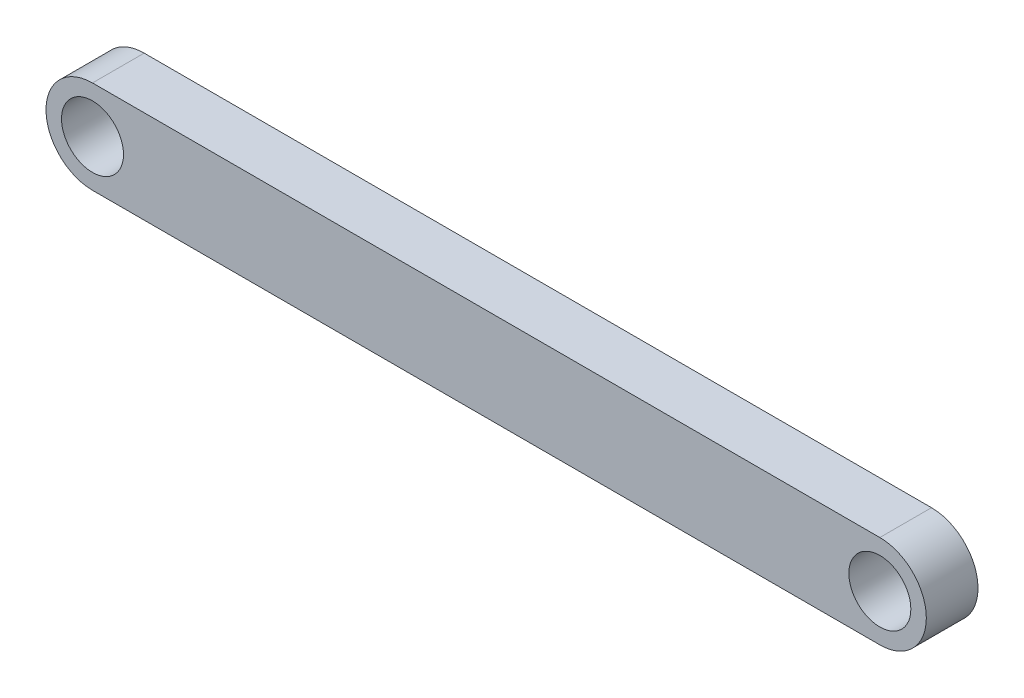
ISO-10303-21;
HEADER;
FILE_DESCRIPTION(('STEP AP214'),'2;1');
FILE_NAME('part.step','',(''),(''),'','','');
FILE_SCHEMA(('AUTOMOTIVE_DESIGN { 1 0 10303 214 1 1 1 1 }'));
ENDSEC;
DATA;
#1=APPLICATION_CONTEXT('core data for automotive mechanical design processes');
#2=APPLICATION_PROTOCOL_DEFINITION('international standard','automotive_design',2000,#1);
#3=PRODUCT_CONTEXT('',#1,'mechanical');
#4=PRODUCT('Part','Part','',(#3));
#5=PRODUCT_RELATED_PRODUCT_CATEGORY('part','',(#4));
#6=PRODUCT_DEFINITION_FORMATION('','',#4);
#7=PRODUCT_DEFINITION_CONTEXT('part definition',#1,'design');
#8=PRODUCT_DEFINITION('design','',#6,#7);
#9=PRODUCT_DEFINITION_SHAPE('','',#8);
#10=(LENGTH_UNIT() NAMED_UNIT(*) SI_UNIT(.MILLI.,.METRE.));
#11=(NAMED_UNIT(*) PLANE_ANGLE_UNIT() SI_UNIT($,.RADIAN.));
#12=(NAMED_UNIT(*) SI_UNIT($,.STERADIAN.) SOLID_ANGLE_UNIT());
#13=UNCERTAINTY_MEASURE_WITH_UNIT(LENGTH_MEASURE(1.E-05),#10,'distance_accuracy_value','');
#14=(GEOMETRIC_REPRESENTATION_CONTEXT(3) GLOBAL_UNCERTAINTY_ASSIGNED_CONTEXT((#13)) GLOBAL_UNIT_ASSIGNED_CONTEXT((#10,
#11,#12)) REPRESENTATION_CONTEXT('',''));
#15=CARTESIAN_POINT('',(0.,0.,0.));
#16=DIRECTION('',(0.,0.,1.));
#17=DIRECTION('',(1.,0.,0.));
#18=AXIS2_PLACEMENT_3D('',#15,#16,#17);
#19=CARTESIAN_POINT('',(38.1,0.,5.));
#20=DIRECTION('',(0.,0.,-1.));
#21=DIRECTION('',(-1.,0.,0.));
#22=AXIS2_PLACEMENT_3D('',#19,#20,#21);
#23=CYLINDRICAL_SURFACE('',#22,4.5);
#24=CARTESIAN_POINT('',(38.1,0.,0.));
#25=DIRECTION('',(0.,0.,1.));
#26=DIRECTION('',(1.,0.,0.));
#27=AXIS2_PLACEMENT_3D('',#24,#25,#26);
#28=CIRCLE('',#27,4.5);
#29=CARTESIAN_POINT('',(38.1,-4.49999999999999,0.));
#30=VERTEX_POINT('',#29);
#31=CARTESIAN_POINT('',(38.1,4.50000000000001,0.));
#32=VERTEX_POINT('',#31);
#33=EDGE_CURVE('E114',#30,#32,#28,.T.);
#34=ORIENTED_EDGE('',*,*,#33,.T.);
#35=DIRECTION('',(0.,0.,-1.));
#36=VECTOR('',#35,1.);
#37=CARTESIAN_POINT('',(38.1,4.50000000000001,5.));
#38=LINE('',#37,#36);
#39=CARTESIAN_POINT('',(38.1,4.50000000000001,5.));
#40=VERTEX_POINT('',#39);
#41=EDGE_CURVE('E11',#40,#32,#38,.T.);
#42=ORIENTED_EDGE('',*,*,#41,.F.);
#43=CARTESIAN_POINT('',(38.1,0.,5.));
#44=DIRECTION('',(0.,0.,1.));
#45=DIRECTION('',(1.,0.,0.));
#46=AXIS2_PLACEMENT_3D('',#43,#44,#45);
#47=CIRCLE('',#46,4.5);
#48=CARTESIAN_POINT('',(38.1,-4.49999999999999,5.));
#49=VERTEX_POINT('',#48);
#50=EDGE_CURVE('E100',#49,#40,#47,.T.);
#51=ORIENTED_EDGE('',*,*,#50,.F.);
#52=DIRECTION('',(0.,0.,-1.));
#53=VECTOR('',#52,1.);
#54=CARTESIAN_POINT('',(38.1,-4.49999999999999,5.));
#55=LINE('',#54,#53);
#56=EDGE_CURVE('E108',#49,#30,#55,.T.);
#57=ORIENTED_EDGE('',*,*,#56,.T.);
#58=EDGE_LOOP('',(#34,#42,#51,#57));
#59=FACE_BOUND('',#58,.T.);
#60=ADVANCED_FACE('F44',(#59),#23,.T.);
#61=CARTESIAN_POINT('',(38.1,4.50000000000001,5.));
#62=DIRECTION('',(0.,-1.,0.));
#63=DIRECTION('',(1.,0.,0.));
#64=AXIS2_PLACEMENT_3D('',#61,#62,#63);
#65=PLANE('',#64);
#66=DIRECTION('',(-1.,0.,0.));
#67=VECTOR('',#66,1.);
#68=CARTESIAN_POINT('',(38.1,4.50000000000001,0.));
#69=LINE('',#68,#67);
#70=CARTESIAN_POINT('',(-38.1,4.49999999999999,0.));
#71=VERTEX_POINT('',#70);
#72=EDGE_CURVE('E105',#32,#71,#69,.T.);
#73=ORIENTED_EDGE('',*,*,#72,.T.);
#74=DIRECTION('',(0.,0.,-1.));
#75=VECTOR('',#74,1.);
#76=CARTESIAN_POINT('',(-38.1,4.49999999999999,5.));
#77=LINE('',#76,#75);
#78=CARTESIAN_POINT('',(-38.1,4.49999999999999,5.));
#79=VERTEX_POINT('',#78);
#80=EDGE_CURVE('E53',#79,#71,#77,.T.);
#81=ORIENTED_EDGE('',*,*,#80,.F.);
#82=DIRECTION('',(-1.,0.,0.));
#83=VECTOR('',#82,1.);
#84=CARTESIAN_POINT('',(38.1,4.50000000000001,5.));
#85=LINE('',#84,#83);
#86=EDGE_CURVE('E95',#40,#79,#85,.T.);
#87=ORIENTED_EDGE('',*,*,#86,.F.);
#88=ORIENTED_EDGE('',*,*,#41,.T.);
#89=EDGE_LOOP('',(#73,#81,#87,#88));
#90=FACE_BOUND('',#89,.T.);
#91=ADVANCED_FACE('F101',(#90),#65,.F.);
#92=CARTESIAN_POINT('',(-38.1,0.,5.));
#93=DIRECTION('',(0.,0.,-1.));
#94=DIRECTION('',(-1.,0.,0.));
#95=AXIS2_PLACEMENT_3D('',#92,#93,#94);
#96=CYLINDRICAL_SURFACE('',#95,4.5);
#97=CARTESIAN_POINT('',(-38.1,0.,0.));
#98=DIRECTION('',(0.,0.,1.));
#99=DIRECTION('',(1.,0.,0.));
#100=AXIS2_PLACEMENT_3D('',#97,#98,#99);
#101=CIRCLE('',#100,4.5);
#102=CARTESIAN_POINT('',(-38.1,-4.50000000000001,0.));
#103=VERTEX_POINT('',#102);
#104=EDGE_CURVE('E79',#71,#103,#101,.T.);
#105=ORIENTED_EDGE('',*,*,#104,.T.);
#106=DIRECTION('',(0.,0.,-1.));
#107=VECTOR('',#106,1.);
#108=CARTESIAN_POINT('',(-38.1,-4.50000000000001,5.));
#109=LINE('',#108,#107);
#110=CARTESIAN_POINT('',(-38.1,-4.50000000000001,5.));
#111=VERTEX_POINT('',#110);
#112=EDGE_CURVE('E102',#111,#103,#109,.T.);
#113=ORIENTED_EDGE('',*,*,#112,.F.);
#114=CARTESIAN_POINT('',(-38.1,0.,5.));
#115=DIRECTION('',(0.,0.,1.));
#116=DIRECTION('',(1.,0.,0.));
#117=AXIS2_PLACEMENT_3D('',#114,#115,#116);
#118=CIRCLE('',#117,4.5);
#119=EDGE_CURVE('E92',#79,#111,#118,.T.);
#120=ORIENTED_EDGE('',*,*,#119,.F.);
#121=ORIENTED_EDGE('',*,*,#80,.T.);
#122=EDGE_LOOP('',(#105,#113,#120,#121));
#123=FACE_BOUND('',#122,.T.);
#124=ADVANCED_FACE('F104',(#123),#96,.T.);
#125=CARTESIAN_POINT('',(38.1,-4.49999999999999,5.));
#126=DIRECTION('',(0.,1.,0.));
#127=DIRECTION('',(-1.,0.,0.));
#128=AXIS2_PLACEMENT_3D('',#125,#126,#127);
#129=PLANE('',#128);
#130=DIRECTION('',(1.,0.,0.));
#131=VECTOR('',#130,1.);
#132=CARTESIAN_POINT('',(38.1,-4.49999999999999,0.));
#133=LINE('',#132,#131);
#134=EDGE_CURVE('E83',#103,#30,#133,.T.);
#135=ORIENTED_EDGE('',*,*,#134,.T.);
#136=ORIENTED_EDGE('',*,*,#56,.F.);
#137=DIRECTION('',(1.,0.,0.));
#138=VECTOR('',#137,1.);
#139=CARTESIAN_POINT('',(38.1,-4.49999999999999,5.));
#140=LINE('',#139,#138);
#141=EDGE_CURVE('E65',#111,#49,#140,.T.);
#142=ORIENTED_EDGE('',*,*,#141,.F.);
#143=ORIENTED_EDGE('',*,*,#112,.T.);
#144=EDGE_LOOP('',(#135,#136,#142,#143));
#145=FACE_BOUND('',#144,.T.);
#146=ADVANCED_FACE('F130',(#145),#129,.F.);
#147=CARTESIAN_POINT('',(38.1,0.,5.));
#148=DIRECTION('',(0.,0.,1.));
#149=DIRECTION('',(1.,0.,0.));
#150=AXIS2_PLACEMENT_3D('',#147,#148,#149);
#151=PLANE('',#150);
#152=CARTESIAN_POINT('',(-38.1,0.,5.));
#153=DIRECTION('',(0.,0.,1.));
#154=DIRECTION('',(1.,0.,0.));
#155=AXIS2_PLACEMENT_3D('',#152,#153,#154);
#156=CIRCLE('',#155,3.);
#157=CARTESIAN_POINT('',(-35.1,0.,5.));
#158=VERTEX_POINT('',#157);
#159=EDGE_CURVE('E142',#158,#158,#156,.T.);
#160=ORIENTED_EDGE('',*,*,#159,.F.);
#161=EDGE_LOOP('',(#160));
#162=FACE_BOUND('',#161,.T.);
#163=CARTESIAN_POINT('',(38.1,0.,5.));
#164=DIRECTION('',(0.,0.,1.));
#165=DIRECTION('',(1.,0.,0.));
#166=AXIS2_PLACEMENT_3D('',#163,#164,#165);
#167=CIRCLE('',#166,3.);
#168=CARTESIAN_POINT('',(41.1,0.,5.));
#169=VERTEX_POINT('',#168);
#170=EDGE_CURVE('E139',#169,#169,#167,.T.);
#171=ORIENTED_EDGE('',*,*,#170,.F.);
#172=EDGE_LOOP('',(#171));
#173=FACE_BOUND('',#172,.T.);
#174=ORIENTED_EDGE('',*,*,#50,.T.);
#175=ORIENTED_EDGE('',*,*,#86,.T.);
#176=ORIENTED_EDGE('',*,*,#119,.T.);
#177=ORIENTED_EDGE('',*,*,#141,.T.);
#178=EDGE_LOOP('',(#174,#175,#176,#177));
#179=FACE_BOUND('',#178,.T.);
#180=ADVANCED_FACE('F91',(#162,#173,#179),#151,.T.);
#181=CARTESIAN_POINT('',(38.1,0.,0.));
#182=DIRECTION('',(0.,0.,1.));
#183=DIRECTION('',(1.,0.,0.));
#184=AXIS2_PLACEMENT_3D('',#181,#182,#183);
#185=PLANE('',#184);
#186=CARTESIAN_POINT('',(-38.1,0.,0.));
#187=DIRECTION('',(0.,0.,1.));
#188=DIRECTION('',(1.,0.,0.));
#189=AXIS2_PLACEMENT_3D('',#186,#187,#188);
#190=CIRCLE('',#189,3.);
#191=CARTESIAN_POINT('',(-35.1,0.,0.));
#192=VERTEX_POINT('',#191);
#193=EDGE_CURVE('E120',#192,#192,#190,.T.);
#194=ORIENTED_EDGE('',*,*,#193,.T.);
#195=EDGE_LOOP('',(#194));
#196=FACE_BOUND('',#195,.T.);
#197=CARTESIAN_POINT('',(38.1,0.,0.));
#198=DIRECTION('',(0.,0.,1.));
#199=DIRECTION('',(1.,0.,0.));
#200=AXIS2_PLACEMENT_3D('',#197,#198,#199);
#201=CIRCLE('',#200,3.);
#202=CARTESIAN_POINT('',(41.1,0.,0.));
#203=VERTEX_POINT('',#202);
#204=EDGE_CURVE('E134',#203,#203,#201,.T.);
#205=ORIENTED_EDGE('',*,*,#204,.T.);
#206=EDGE_LOOP('',(#205));
#207=FACE_BOUND('',#206,.T.);
#208=ORIENTED_EDGE('',*,*,#33,.F.);
#209=ORIENTED_EDGE('',*,*,#134,.F.);
#210=ORIENTED_EDGE('',*,*,#104,.F.);
#211=ORIENTED_EDGE('',*,*,#72,.F.);
#212=EDGE_LOOP('',(#208,#209,#210,#211));
#213=FACE_BOUND('',#212,.T.);
#214=ADVANCED_FACE('F128',(#196,#207,#213),#185,.F.);
#215=CARTESIAN_POINT('',(38.1,0.,0.));
#216=DIRECTION('',(0.,0.,1.));
#217=DIRECTION('',(1.,0.,0.));
#218=AXIS2_PLACEMENT_3D('',#215,#216,#217);
#219=CYLINDRICAL_SURFACE('',#218,3.);
#220=ORIENTED_EDGE('',*,*,#204,.F.);
#221=EDGE_LOOP('',(#220));
#222=FACE_BOUND('',#221,.T.);
#223=ORIENTED_EDGE('',*,*,#170,.T.);
#224=EDGE_LOOP('',(#223));
#225=FACE_BOUND('',#224,.T.);
#226=ADVANCED_FACE('F154',(#222,#225),#219,.F.);
#227=CARTESIAN_POINT('',(-38.1,0.,0.));
#228=DIRECTION('',(0.,0.,1.));
#229=DIRECTION('',(1.,0.,0.));
#230=AXIS2_PLACEMENT_3D('',#227,#228,#229);
#231=CYLINDRICAL_SURFACE('',#230,3.);
#232=ORIENTED_EDGE('',*,*,#193,.F.);
#233=EDGE_LOOP('',(#232));
#234=FACE_BOUND('',#233,.T.);
#235=ORIENTED_EDGE('',*,*,#159,.T.);
#236=EDGE_LOOP('',(#235));
#237=FACE_BOUND('',#236,.T.);
#238=ADVANCED_FACE('F155',(#234,#237),#231,.F.);
#239=CLOSED_SHELL('',(#60,#91,#124,#146,#180,#214,#226,#238));
#240=MANIFOLD_SOLID_BREP('B2',#239);
#241=ADVANCED_BREP_SHAPE_REPRESENTATION('',(#18,#240),#14);
#242=SHAPE_DEFINITION_REPRESENTATION(#9,#241);
ENDSEC;
END-ISO-10303-21;
